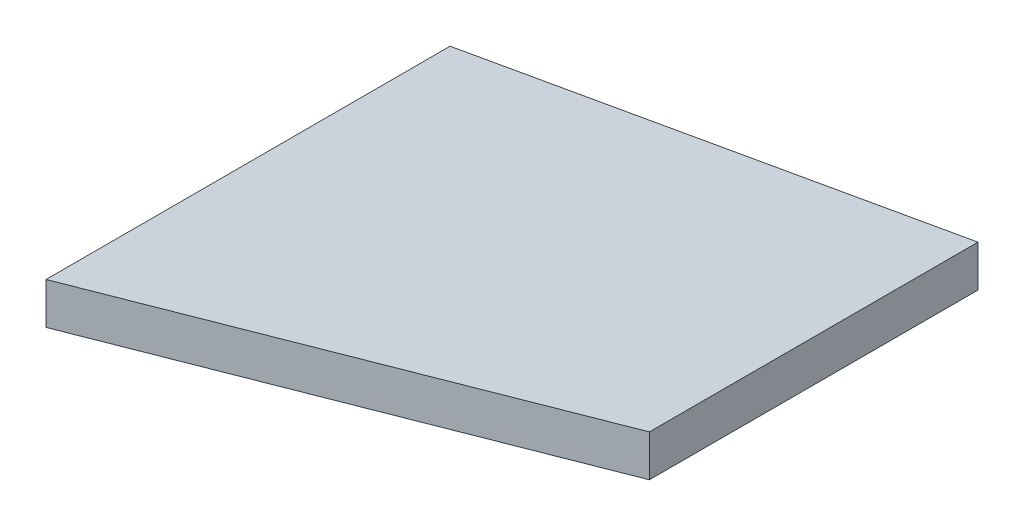
ISO-10303-21;
HEADER;
FILE_DESCRIPTION(('STEP AP214'),'2;1');
FILE_NAME('part.step','',(''),(''),'','','');
FILE_SCHEMA(('AUTOMOTIVE_DESIGN { 1 0 10303 214 1 1 1 1 }'));
ENDSEC;
DATA;
#1=APPLICATION_CONTEXT('core data for automotive mechanical design processes');
#2=APPLICATION_PROTOCOL_DEFINITION('international standard','automotive_design',2000,#1);
#3=PRODUCT_CONTEXT('',#1,'mechanical');
#4=PRODUCT('Part','Part','',(#3));
#5=PRODUCT_RELATED_PRODUCT_CATEGORY('part','',(#4));
#6=PRODUCT_DEFINITION_FORMATION('','',#4);
#7=PRODUCT_DEFINITION_CONTEXT('part definition',#1,'design');
#8=PRODUCT_DEFINITION('design','',#6,#7);
#9=PRODUCT_DEFINITION_SHAPE('','',#8);
#10=(LENGTH_UNIT() NAMED_UNIT(*) SI_UNIT(.MILLI.,.METRE.));
#11=(NAMED_UNIT(*) PLANE_ANGLE_UNIT() SI_UNIT($,.RADIAN.));
#12=(NAMED_UNIT(*) SI_UNIT($,.STERADIAN.) SOLID_ANGLE_UNIT());
#13=UNCERTAINTY_MEASURE_WITH_UNIT(LENGTH_MEASURE(1.E-05),#10,'distance_accuracy_value','');
#14=(GEOMETRIC_REPRESENTATION_CONTEXT(3) GLOBAL_UNCERTAINTY_ASSIGNED_CONTEXT((#13)) GLOBAL_UNIT_ASSIGNED_CONTEXT((#10,
#11,#12)) REPRESENTATION_CONTEXT('',''));
#15=CARTESIAN_POINT('',(0.,0.,0.));
#16=DIRECTION('',(0.,0.,1.));
#17=DIRECTION('',(1.,0.,0.));
#18=AXIS2_PLACEMENT_3D('',#15,#16,#17);
#19=CARTESIAN_POINT('',(0.,10.268614533833,100.));
#20=DIRECTION('',(0.227229615606418,-0.973841209741793,0.));
#21=DIRECTION('',(0.973841209741793,0.227229615606418,0.));
#22=AXIS2_PLACEMENT_3D('',#19,#20,#21);
#23=PLANE('',#22);
#24=DIRECTION('',(0.971795322587606,0.226752241937108,0.0647863548391703));
#25=VECTOR('',#24,1.);
#26=CARTESIAN_POINT('',(6.29590766002066,11.7376596545045,0.419727177334697));
#27=LINE('',#26,#25);
#28=CARTESIAN_POINT('',(0.,10.268614533833,0.));
#29=VERTEX_POINT('',#28);
#30=CARTESIAN_POINT('',(140.,42.9352812004997,9.33333333333283));
#31=VERTEX_POINT('',#30);
#32=EDGE_CURVE('E91',#29,#31,#27,.T.);
#33=ORIENTED_EDGE('',*,*,#32,.F.);
#34=DIRECTION('',(0.,0.,-1.));
#35=VECTOR('',#34,1.);
#36=CARTESIAN_POINT('',(0.,10.268614533833,100.));
#37=LINE('',#36,#35);
#38=CARTESIAN_POINT('',(0.,10.268614533833,100.));
#39=VERTEX_POINT('',#38);
#40=EDGE_CURVE('E11',#39,#29,#37,.T.);
#41=ORIENTED_EDGE('',*,*,#40,.F.);
#42=DIRECTION('',(-0.971795322587606,-0.226752241937108,0.0647863548391704));
#43=VECTOR('',#42,1.);
#44=CARTESIAN_POINT('',(0.,10.268614533833,100.));
#45=LINE('',#44,#43);
#46=CARTESIAN_POINT('',(140.,42.9352812004997,90.6666666666672));
#47=VERTEX_POINT('',#46);
#48=EDGE_CURVE('E54',#47,#39,#45,.T.);
#49=ORIENTED_EDGE('',*,*,#48,.F.);
#50=DIRECTION('',(0.,0.,-1.));
#51=VECTOR('',#50,1.);
#52=CARTESIAN_POINT('',(140.,42.9352812004997,100.));
#53=LINE('',#52,#51);
#54=EDGE_CURVE('E81',#47,#31,#53,.T.);
#55=ORIENTED_EDGE('',*,*,#54,.T.);
#56=EDGE_LOOP('',(#33,#41,#49,#55));
#57=FACE_BOUND('',#56,.T.);
#58=ADVANCED_FACE('F40',(#57),#23,.F.);
#59=CARTESIAN_POINT('',(140.,32.6666666666667,100.));
#60=DIRECTION('',(-0.227229615606418,0.973841209741793,0.));
#61=DIRECTION('',(-0.973841209741793,-0.227229615606418,0.));
#62=AXIS2_PLACEMENT_3D('',#59,#60,#61);
#63=PLANE('',#62);
#64=DIRECTION('',(-0.971795322587606,-0.226752241937108,-0.0647863548391703));
#65=VECTOR('',#64,1.);
#66=CARTESIAN_POINT('',(145.708289611752,33.9986009094088,9.71388597411631));
#67=LINE('',#66,#65);
#68=CARTESIAN_POINT('',(140.,32.6666666666667,9.33333333333283));
#69=VERTEX_POINT('',#68);
#70=CARTESIAN_POINT('',(0.,0.,0.));
#71=VERTEX_POINT('',#70);
#72=EDGE_CURVE('E102',#69,#71,#67,.T.);
#73=ORIENTED_EDGE('',*,*,#72,.F.);
#74=DIRECTION('',(0.,0.,-1.));
#75=VECTOR('',#74,1.);
#76=CARTESIAN_POINT('',(140.,32.6666666666667,100.));
#77=LINE('',#76,#75);
#78=CARTESIAN_POINT('',(140.,32.6666666666667,90.6666666666672));
#79=VERTEX_POINT('',#78);
#80=EDGE_CURVE('E90',#79,#69,#77,.T.);
#81=ORIENTED_EDGE('',*,*,#80,.F.);
#82=DIRECTION('',(0.971795322587606,0.226752241937108,-0.0647863548391704));
#83=VECTOR('',#82,1.);
#84=CARTESIAN_POINT('',(139.412381951731,32.5295557887373,90.7058412032184));
#85=LINE('',#84,#83);
#86=CARTESIAN_POINT('',(0.,0.,100.));
#87=VERTEX_POINT('',#86);
#88=EDGE_CURVE('E76',#87,#79,#85,.T.);
#89=ORIENTED_EDGE('',*,*,#88,.F.);
#90=DIRECTION('',(0.,0.,-1.));
#91=VECTOR('',#90,1.);
#92=CARTESIAN_POINT('',(0.,0.,100.));
#93=LINE('',#92,#91);
#94=EDGE_CURVE('E48',#87,#71,#93,.T.);
#95=ORIENTED_EDGE('',*,*,#94,.T.);
#96=EDGE_LOOP('',(#73,#81,#89,#95));
#97=FACE_BOUND('',#96,.T.);
#98=ADVANCED_FACE('F88',(#97),#63,.F.);
#99=CARTESIAN_POINT('',(140.,42.9352812004997,100.));
#100=DIRECTION('',(-1.,0.,0.));
#101=DIRECTION('',(0.,0.,1.));
#102=AXIS2_PLACEMENT_3D('',#99,#100,#101);
#103=PLANE('',#102);
#104=DIRECTION('',(0.,-1.,0.));
#105=VECTOR('',#104,1.);
#106=CARTESIAN_POINT('',(140.,65.,9.33333333333283));
#107=LINE('',#106,#105);
#108=EDGE_CURVE('E104',#31,#69,#107,.T.);
#109=ORIENTED_EDGE('',*,*,#108,.F.);
#110=ORIENTED_EDGE('',*,*,#54,.F.);
#111=DIRECTION('',(0.,-1.,0.));
#112=VECTOR('',#111,1.);
#113=CARTESIAN_POINT('',(140.,65.,90.6666666666672));
#114=LINE('',#113,#112);
#115=EDGE_CURVE('E105',#47,#79,#114,.T.);
#116=ORIENTED_EDGE('',*,*,#115,.T.);
#117=ORIENTED_EDGE('',*,*,#80,.T.);
#118=EDGE_LOOP('',(#109,#110,#116,#117));
#119=FACE_BOUND('',#118,.T.);
#120=ADVANCED_FACE('F113',(#119),#103,.F.);
#121=CARTESIAN_POINT('',(0.,0.,100.));
#122=DIRECTION('',(1.,0.,0.));
#123=DIRECTION('',(0.,0.,-1.));
#124=AXIS2_PLACEMENT_3D('',#121,#122,#123);
#125=PLANE('',#124);
#126=DIRECTION('',(0.,-1.,0.));
#127=VECTOR('',#126,1.);
#128=CARTESIAN_POINT('',(0.,0.,0.));
#129=LINE('',#128,#127);
#130=EDGE_CURVE('E82',#29,#71,#129,.T.);
#131=ORIENTED_EDGE('',*,*,#130,.T.);
#132=ORIENTED_EDGE('',*,*,#94,.F.);
#133=DIRECTION('',(0.,-1.,0.));
#134=VECTOR('',#133,1.);
#135=CARTESIAN_POINT('',(0.,0.,100.));
#136=LINE('',#135,#134);
#137=EDGE_CURVE('E73',#39,#87,#136,.T.);
#138=ORIENTED_EDGE('',*,*,#137,.F.);
#139=ORIENTED_EDGE('',*,*,#40,.T.);
#140=EDGE_LOOP('',(#131,#132,#138,#139));
#141=FACE_BOUND('',#140,.T.);
#142=ADVANCED_FACE('F94',(#141),#125,.F.);
#143=CARTESIAN_POINT('',(140.,65.,9.33333333333283));
#144=DIRECTION('',(0.0665190105237705,0.,-0.997785157856609));
#145=DIRECTION('',(-0.997785157856609,0.,-0.0665190105237705));
#146=AXIS2_PLACEMENT_3D('',#143,#144,#145);
#147=PLANE('',#146);
#148=ORIENTED_EDGE('',*,*,#32,.T.);
#149=ORIENTED_EDGE('',*,*,#108,.T.);
#150=ORIENTED_EDGE('',*,*,#72,.T.);
#151=ORIENTED_EDGE('',*,*,#130,.F.);
#152=EDGE_LOOP('',(#148,#149,#150,#151));
#153=FACE_BOUND('',#152,.T.);
#154=ADVANCED_FACE('F109',(#153),#147,.T.);
#155=CARTESIAN_POINT('',(140.,65.,90.6666666666672));
#156=DIRECTION('',(0.0665190105237705,0.,0.997785157856609));
#157=DIRECTION('',(0.997785157856609,0.,-0.0665190105237705));
#158=AXIS2_PLACEMENT_3D('',#155,#156,#157);
#159=PLANE('',#158);
#160=ORIENTED_EDGE('',*,*,#48,.T.);
#161=ORIENTED_EDGE('',*,*,#137,.T.);
#162=ORIENTED_EDGE('',*,*,#88,.T.);
#163=ORIENTED_EDGE('',*,*,#115,.F.);
#164=EDGE_LOOP('',(#160,#161,#162,#163));
#165=FACE_BOUND('',#164,.T.);
#166=ADVANCED_FACE('F75',(#165),#159,.T.);
#167=CLOSED_SHELL('',(#58,#98,#120,#142,#154,#166));
#168=MANIFOLD_SOLID_BREP('B2',#167);
#169=ADVANCED_BREP_SHAPE_REPRESENTATION('',(#18,#168),#14);
#170=SHAPE_DEFINITION_REPRESENTATION(#9,#169);
ENDSEC;
END-ISO-10303-21;
